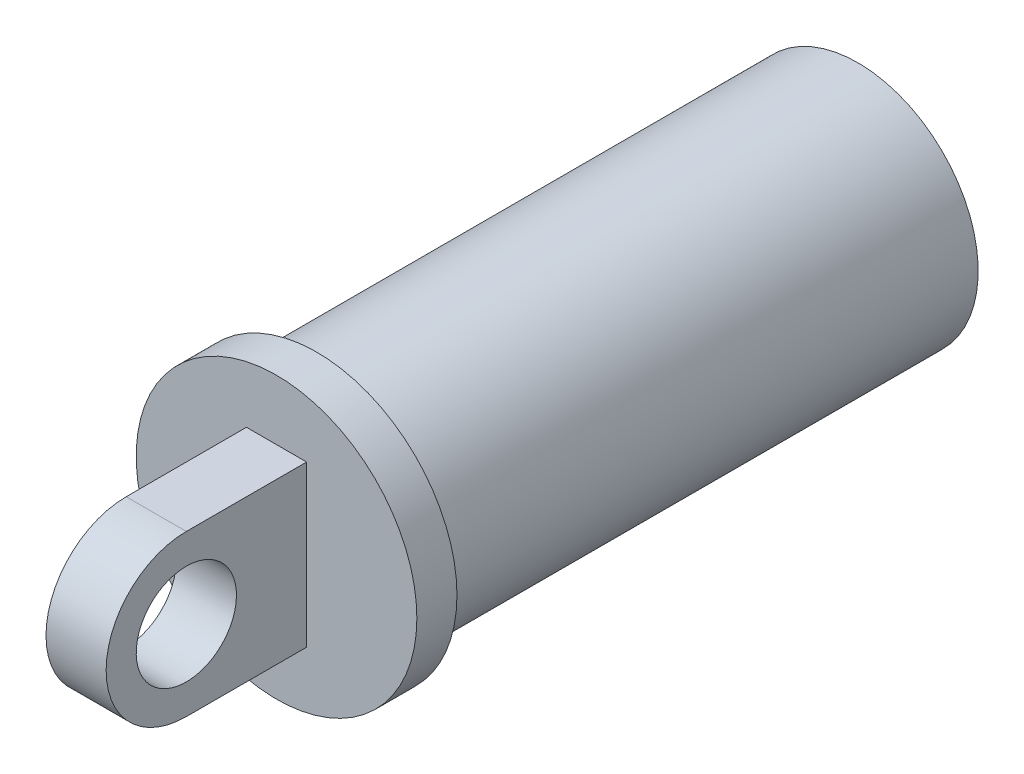
ISO-10303-21;
HEADER;
FILE_DESCRIPTION(('STEP AP214'),'2;1');
FILE_NAME('part.step','',(''),(''),'','','');
FILE_SCHEMA(('AUTOMOTIVE_DESIGN { 1 0 10303 214 1 1 1 1 }'));
ENDSEC;
DATA;
#1=APPLICATION_CONTEXT('core data for automotive mechanical design processes');
#2=APPLICATION_PROTOCOL_DEFINITION('international standard','automotive_design',2000,#1);
#3=PRODUCT_CONTEXT('',#1,'mechanical');
#4=PRODUCT('Part','Part','',(#3));
#5=PRODUCT_RELATED_PRODUCT_CATEGORY('part','',(#4));
#6=PRODUCT_DEFINITION_FORMATION('','',#4);
#7=PRODUCT_DEFINITION_CONTEXT('part definition',#1,'design');
#8=PRODUCT_DEFINITION('design','',#6,#7);
#9=PRODUCT_DEFINITION_SHAPE('','',#8);
#10=(LENGTH_UNIT() NAMED_UNIT(*) SI_UNIT(.MILLI.,.METRE.));
#11=(NAMED_UNIT(*) PLANE_ANGLE_UNIT() SI_UNIT($,.RADIAN.));
#12=(NAMED_UNIT(*) SI_UNIT($,.STERADIAN.) SOLID_ANGLE_UNIT());
#13=UNCERTAINTY_MEASURE_WITH_UNIT(LENGTH_MEASURE(1.E-05),#10,'distance_accuracy_value','');
#14=(GEOMETRIC_REPRESENTATION_CONTEXT(3) GLOBAL_UNCERTAINTY_ASSIGNED_CONTEXT((#13)) GLOBAL_UNIT_ASSIGNED_CONTEXT((#10,
#11,#12)) REPRESENTATION_CONTEXT('',''));
#15=CARTESIAN_POINT('',(0.,0.,0.));
#16=DIRECTION('',(0.,0.,1.));
#17=DIRECTION('',(1.,0.,0.));
#18=AXIS2_PLACEMENT_3D('',#15,#16,#17);
#19=CARTESIAN_POINT('',(0.,0.,0.));
#20=DIRECTION('',(0.,0.,1.));
#21=DIRECTION('',(-1.,0.,0.));
#22=AXIS2_PLACEMENT_3D('',#19,#20,#21);
#23=CYLINDRICAL_SURFACE('',#22,6.);
#24=CARTESIAN_POINT('',(0.,0.,12.5));
#25=DIRECTION('',(0.,0.,-1.));
#26=DIRECTION('',(-1.,0.,0.));
#27=AXIS2_PLACEMENT_3D('',#24,#25,#26);
#28=CIRCLE('',#27,6.);
#29=CARTESIAN_POINT('',(6.,0.,12.5));
#30=VERTEX_POINT('',#29);
#31=EDGE_CURVE('E145',#30,#30,#28,.T.);
#32=ORIENTED_EDGE('',*,*,#31,.T.);
#33=EDGE_LOOP('',(#32));
#34=FACE_BOUND('',#33,.T.);
#35=CARTESIAN_POINT('',(0.,0.,-14.5));
#36=DIRECTION('',(0.,0.,1.));
#37=DIRECTION('',(1.,0.,0.));
#38=AXIS2_PLACEMENT_3D('',#35,#36,#37);
#39=CIRCLE('',#38,6.);
#40=CARTESIAN_POINT('',(-6.,0.,-14.5));
#41=VERTEX_POINT('',#40);
#42=EDGE_CURVE('E128',#41,#41,#39,.T.);
#43=ORIENTED_EDGE('',*,*,#42,.T.);
#44=EDGE_LOOP('',(#43));
#45=FACE_BOUND('',#44,.T.);
#46=ADVANCED_FACE('F16',(#34,#45),#23,.T.);
#47=CARTESIAN_POINT('',(0.,0.,0.));
#48=DIRECTION('',(0.,0.,1.));
#49=DIRECTION('',(-1.,0.,0.));
#50=AXIS2_PLACEMENT_3D('',#47,#48,#49);
#51=CYLINDRICAL_SURFACE('',#50,5.);
#52=CARTESIAN_POINT('',(0.,0.,12.5));
#53=DIRECTION('',(0.,0.,-1.));
#54=DIRECTION('',(-1.,0.,0.));
#55=AXIS2_PLACEMENT_3D('',#52,#53,#54);
#56=CIRCLE('',#55,5.);
#57=CARTESIAN_POINT('',(5.,0.,12.5));
#58=VERTEX_POINT('',#57);
#59=EDGE_CURVE('E27',#58,#58,#56,.T.);
#60=ORIENTED_EDGE('',*,*,#59,.F.);
#61=EDGE_LOOP('',(#60));
#62=FACE_BOUND('',#61,.T.);
#63=CARTESIAN_POINT('',(0.,0.,-12.5));
#64=DIRECTION('',(0.,0.,1.));
#65=DIRECTION('',(-1.,0.,0.));
#66=AXIS2_PLACEMENT_3D('',#63,#64,#65);
#67=CIRCLE('',#66,5.);
#68=CARTESIAN_POINT('',(5.,0.,-12.5));
#69=VERTEX_POINT('',#68);
#70=EDGE_CURVE('E112',#69,#69,#67,.T.);
#71=ORIENTED_EDGE('',*,*,#70,.F.);
#72=EDGE_LOOP('',(#71));
#73=FACE_BOUND('',#72,.T.);
#74=ADVANCED_FACE('F228',(#62,#73),#51,.F.);
#75=CARTESIAN_POINT('',(0.,0.,14.5));
#76=DIRECTION('',(0.,0.,-1.));
#77=DIRECTION('',(0.,-1.,0.));
#78=AXIS2_PLACEMENT_3D('',#75,#76,#77);
#79=PLANE('',#78);
#80=DIRECTION('',(0.,1.,0.));
#81=VECTOR('',#80,1.);
#82=CARTESIAN_POINT('',(-1.5,-4.,14.5));
#83=LINE('',#82,#81);
#84=CARTESIAN_POINT('',(-1.5,-4.,14.5));
#85=VERTEX_POINT('',#84);
#86=CARTESIAN_POINT('',(-1.5,4.,14.5));
#87=VERTEX_POINT('',#86);
#88=EDGE_CURVE('E158',#85,#87,#83,.T.);
#89=ORIENTED_EDGE('',*,*,#88,.T.);
#90=DIRECTION('',(1.,0.,0.));
#91=VECTOR('',#90,1.);
#92=CARTESIAN_POINT('',(-1.5,4.,14.5));
#93=LINE('',#92,#91);
#94=CARTESIAN_POINT('',(1.5,4.,14.5));
#95=VERTEX_POINT('',#94);
#96=EDGE_CURVE('E149',#87,#95,#93,.T.);
#97=ORIENTED_EDGE('',*,*,#96,.T.);
#98=DIRECTION('',(0.,-1.,0.));
#99=VECTOR('',#98,1.);
#100=CARTESIAN_POINT('',(1.5,4.,14.5));
#101=LINE('',#100,#99);
#102=CARTESIAN_POINT('',(1.5,-4.,14.5));
#103=VERTEX_POINT('',#102);
#104=EDGE_CURVE('E20',#95,#103,#101,.T.);
#105=ORIENTED_EDGE('',*,*,#104,.T.);
#106=DIRECTION('',(-1.,0.,0.));
#107=VECTOR('',#106,1.);
#108=CARTESIAN_POINT('',(1.5,-4.,14.5));
#109=LINE('',#108,#107);
#110=EDGE_CURVE('E97',#103,#85,#109,.T.);
#111=ORIENTED_EDGE('',*,*,#110,.T.);
#112=EDGE_LOOP('',(#89,#97,#105,#111));
#113=FACE_BOUND('',#112,.T.);
#114=CARTESIAN_POINT('',(0.,0.,14.5));
#115=DIRECTION('',(0.,0.,-1.));
#116=DIRECTION('',(-1.,0.,0.));
#117=AXIS2_PLACEMENT_3D('',#114,#115,#116);
#118=CIRCLE('',#117,7.);
#119=CARTESIAN_POINT('',(7.,0.,14.5));
#120=VERTEX_POINT('',#119);
#121=EDGE_CURVE('E10',#120,#120,#118,.T.);
#122=ORIENTED_EDGE('',*,*,#121,.F.);
#123=EDGE_LOOP('',(#122));
#124=FACE_BOUND('',#123,.T.);
#125=ADVANCED_FACE('F233',(#113,#124),#79,.F.);
#126=CARTESIAN_POINT('',(0.,0.,12.5));
#127=DIRECTION('',(0.,0.,1.));
#128=DIRECTION('',(-1.,0.,0.));
#129=AXIS2_PLACEMENT_3D('',#126,#127,#128);
#130=CYLINDRICAL_SURFACE('',#129,7.);
#131=CARTESIAN_POINT('',(0.,0.,12.5));
#132=DIRECTION('',(0.,0.,-1.));
#133=DIRECTION('',(-1.,0.,0.));
#134=AXIS2_PLACEMENT_3D('',#131,#132,#133);
#135=CIRCLE('',#134,7.);
#136=CARTESIAN_POINT('',(7.,0.,12.5));
#137=VERTEX_POINT('',#136);
#138=EDGE_CURVE('E185',#137,#137,#135,.T.);
#139=ORIENTED_EDGE('',*,*,#138,.F.);
#140=EDGE_LOOP('',(#139));
#141=FACE_BOUND('',#140,.T.);
#142=ORIENTED_EDGE('',*,*,#121,.T.);
#143=EDGE_LOOP('',(#142));
#144=FACE_BOUND('',#143,.T.);
#145=ADVANCED_FACE('F251',(#141,#144),#130,.T.);
#146=CARTESIAN_POINT('',(0.,0.,12.5));
#147=DIRECTION('',(0.,0.,-1.));
#148=DIRECTION('',(0.,-1.,0.));
#149=AXIS2_PLACEMENT_3D('',#146,#147,#148);
#150=PLANE('',#149);
#151=ORIENTED_EDGE('',*,*,#59,.T.);
#152=EDGE_LOOP('',(#151));
#153=FACE_BOUND('',#152,.T.);
#154=ADVANCED_FACE('F249',(#153),#150,.T.);
#155=CARTESIAN_POINT('',(0.,0.,12.5));
#156=DIRECTION('',(0.,0.,-1.));
#157=DIRECTION('',(0.,-1.,0.));
#158=AXIS2_PLACEMENT_3D('',#155,#156,#157);
#159=PLANE('',#158);
#160=ORIENTED_EDGE('',*,*,#31,.F.);
#161=EDGE_LOOP('',(#160));
#162=FACE_BOUND('',#161,.T.);
#163=ORIENTED_EDGE('',*,*,#138,.T.);
#164=EDGE_LOOP('',(#163));
#165=FACE_BOUND('',#164,.T.);
#166=ADVANCED_FACE('F248',(#162,#165),#159,.T.);
#167=CARTESIAN_POINT('',(1.5,0.,19.5));
#168=DIRECTION('',(1.,0.,0.));
#169=DIRECTION('',(0.,1.,0.));
#170=AXIS2_PLACEMENT_3D('',#167,#168,#169);
#171=PLANE('',#170);
#172=CARTESIAN_POINT('',(1.5,0.,20.5));
#173=DIRECTION('',(-1.,0.,0.));
#174=DIRECTION('',(0.,-1.,0.));
#175=AXIS2_PLACEMENT_3D('',#172,#173,#174);
#176=CIRCLE('',#175,2.5);
#177=CARTESIAN_POINT('',(1.5,2.5,20.5));
#178=VERTEX_POINT('',#177);
#179=EDGE_CURVE('E147',#178,#178,#176,.T.);
#180=ORIENTED_EDGE('',*,*,#179,.T.);
#181=EDGE_LOOP('',(#180));
#182=FACE_BOUND('',#181,.T.);
#183=CARTESIAN_POINT('',(1.5,0.,20.5));
#184=DIRECTION('',(-1.,0.,0.));
#185=DIRECTION('',(0.,0.707106781186547,0.707106781186548));
#186=AXIS2_PLACEMENT_3D('',#183,#184,#185);
#187=CIRCLE('',#186,4.);
#188=CARTESIAN_POINT('',(1.5,-4.,20.5));
#189=VERTEX_POINT('',#188);
#190=CARTESIAN_POINT('',(1.5,4.,20.5));
#191=VERTEX_POINT('',#190);
#192=EDGE_CURVE('E135',#189,#191,#187,.T.);
#193=ORIENTED_EDGE('',*,*,#192,.F.);
#194=DIRECTION('',(0.,0.,1.));
#195=VECTOR('',#194,1.);
#196=CARTESIAN_POINT('',(1.5,-4.,14.5));
#197=LINE('',#196,#195);
#198=EDGE_CURVE('E130',#103,#189,#197,.T.);
#199=ORIENTED_EDGE('',*,*,#198,.F.);
#200=ORIENTED_EDGE('',*,*,#104,.F.);
#201=DIRECTION('',(0.,0.,-1.));
#202=VECTOR('',#201,1.);
#203=CARTESIAN_POINT('',(1.5,4.,20.5));
#204=LINE('',#203,#202);
#205=EDGE_CURVE('E153',#191,#95,#204,.T.);
#206=ORIENTED_EDGE('',*,*,#205,.F.);
#207=EDGE_LOOP('',(#193,#199,#200,#206));
#208=FACE_BOUND('',#207,.T.);
#209=ADVANCED_FACE('F210',(#182,#208),#171,.T.);
#210=CARTESIAN_POINT('',(0.,4.,24.5));
#211=DIRECTION('',(0.,1.,0.));
#212=DIRECTION('',(1.,0.,0.));
#213=AXIS2_PLACEMENT_3D('',#210,#211,#212);
#214=PLANE('',#213);
#215=DIRECTION('',(-1.,0.,0.));
#216=VECTOR('',#215,1.);
#217=CARTESIAN_POINT('',(1.5,4.,20.5));
#218=LINE('',#217,#216);
#219=CARTESIAN_POINT('',(-1.5,4.,20.5));
#220=VERTEX_POINT('',#219);
#221=EDGE_CURVE('E139',#191,#220,#218,.T.);
#222=ORIENTED_EDGE('',*,*,#221,.F.);
#223=ORIENTED_EDGE('',*,*,#205,.T.);
#224=ORIENTED_EDGE('',*,*,#96,.F.);
#225=DIRECTION('',(0.,0.,1.));
#226=VECTOR('',#225,1.);
#227=CARTESIAN_POINT('',(-1.5,4.,14.5));
#228=LINE('',#227,#226);
#229=EDGE_CURVE('E154',#87,#220,#228,.T.);
#230=ORIENTED_EDGE('',*,*,#229,.T.);
#231=EDGE_LOOP('',(#222,#223,#224,#230));
#232=FACE_BOUND('',#231,.T.);
#233=ADVANCED_FACE('F211',(#232),#214,.T.);
#234=CARTESIAN_POINT('',(0.,0.,20.5));
#235=DIRECTION('',(1.,0.,0.));
#236=DIRECTION('',(0.,-1.,0.));
#237=AXIS2_PLACEMENT_3D('',#234,#235,#236);
#238=CYLINDRICAL_SURFACE('',#237,2.5);
#239=ORIENTED_EDGE('',*,*,#179,.F.);
#240=EDGE_LOOP('',(#239));
#241=FACE_BOUND('',#240,.T.);
#242=CARTESIAN_POINT('',(-1.5,0.,20.5));
#243=DIRECTION('',(1.,0.,0.));
#244=DIRECTION('',(0.,-1.,0.));
#245=AXIS2_PLACEMENT_3D('',#242,#243,#244);
#246=CIRCLE('',#245,2.5);
#247=CARTESIAN_POINT('',(-1.5,2.5,20.5));
#248=VERTEX_POINT('',#247);
#249=EDGE_CURVE('E84',#248,#248,#246,.T.);
#250=ORIENTED_EDGE('',*,*,#249,.F.);
#251=EDGE_LOOP('',(#250));
#252=FACE_BOUND('',#251,.T.);
#253=ADVANCED_FACE('F241',(#241,#252),#238,.F.);
#254=CARTESIAN_POINT('',(0.,0.,-14.5));
#255=DIRECTION('',(0.,0.,1.));
#256=DIRECTION('',(1.,0.,0.));
#257=AXIS2_PLACEMENT_3D('',#254,#255,#256);
#258=PLANE('',#257);
#259=CARTESIAN_POINT('',(0.,0.,-14.5));
#260=DIRECTION('',(0.,0.,1.));
#261=DIRECTION('',(1.,0.,0.));
#262=AXIS2_PLACEMENT_3D('',#259,#260,#261);
#263=CIRCLE('',#262,2.);
#264=CARTESIAN_POINT('',(-2.,0.,-14.5));
#265=VERTEX_POINT('',#264);
#266=EDGE_CURVE('E121',#265,#265,#263,.T.);
#267=ORIENTED_EDGE('',*,*,#266,.T.);
#268=EDGE_LOOP('',(#267));
#269=FACE_BOUND('',#268,.T.);
#270=ORIENTED_EDGE('',*,*,#42,.F.);
#271=EDGE_LOOP('',(#270));
#272=FACE_BOUND('',#271,.T.);
#273=ADVANCED_FACE('F238',(#269,#272),#258,.F.);
#274=CARTESIAN_POINT('',(0.,0.,-12.5));
#275=DIRECTION('',(0.,0.,-1.));
#276=DIRECTION('',(1.,0.,0.));
#277=AXIS2_PLACEMENT_3D('',#274,#275,#276);
#278=CYLINDRICAL_SURFACE('',#277,2.);
#279=CARTESIAN_POINT('',(0.,0.,-12.5));
#280=DIRECTION('',(0.,0.,-1.));
#281=DIRECTION('',(1.,0.,0.));
#282=AXIS2_PLACEMENT_3D('',#279,#280,#281);
#283=CIRCLE('',#282,2.);
#284=CARTESIAN_POINT('',(-2.,0.,-12.5));
#285=VERTEX_POINT('',#284);
#286=EDGE_CURVE('E117',#285,#285,#283,.T.);
#287=ORIENTED_EDGE('',*,*,#286,.F.);
#288=EDGE_LOOP('',(#287));
#289=FACE_BOUND('',#288,.T.);
#290=ORIENTED_EDGE('',*,*,#266,.F.);
#291=EDGE_LOOP('',(#290));
#292=FACE_BOUND('',#291,.T.);
#293=ADVANCED_FACE('F18',(#289,#292),#278,.F.);
#294=CARTESIAN_POINT('',(0.,0.,-12.5));
#295=DIRECTION('',(0.,0.,1.));
#296=DIRECTION('',(1.,0.,0.));
#297=AXIS2_PLACEMENT_3D('',#294,#295,#296);
#298=PLANE('',#297);
#299=ORIENTED_EDGE('',*,*,#286,.T.);
#300=EDGE_LOOP('',(#299));
#301=FACE_BOUND('',#300,.T.);
#302=ORIENTED_EDGE('',*,*,#70,.T.);
#303=EDGE_LOOP('',(#302));
#304=FACE_BOUND('',#303,.T.);
#305=ADVANCED_FACE('F118',(#301,#304),#298,.T.);
#306=CARTESIAN_POINT('',(0.,-4.,14.5));
#307=DIRECTION('',(0.,-1.,0.));
#308=DIRECTION('',(0.,0.,-1.));
#309=AXIS2_PLACEMENT_3D('',#306,#307,#308);
#310=PLANE('',#309);
#311=DIRECTION('',(1.,0.,0.));
#312=VECTOR('',#311,1.);
#313=CARTESIAN_POINT('',(-1.5,-4.,20.5));
#314=LINE('',#313,#312);
#315=CARTESIAN_POINT('',(-1.5,-4.,20.5));
#316=VERTEX_POINT('',#315);
#317=EDGE_CURVE('E142',#316,#189,#314,.T.);
#318=ORIENTED_EDGE('',*,*,#317,.F.);
#319=DIRECTION('',(0.,0.,-1.));
#320=VECTOR('',#319,1.);
#321=CARTESIAN_POINT('',(-1.5,-4.,20.5));
#322=LINE('',#321,#320);
#323=EDGE_CURVE('E160',#316,#85,#322,.T.);
#324=ORIENTED_EDGE('',*,*,#323,.T.);
#325=ORIENTED_EDGE('',*,*,#110,.F.);
#326=ORIENTED_EDGE('',*,*,#198,.T.);
#327=EDGE_LOOP('',(#318,#324,#325,#326));
#328=FACE_BOUND('',#327,.T.);
#329=ADVANCED_FACE('F216',(#328),#310,.T.);
#330=CARTESIAN_POINT('',(0.,0.,20.5));
#331=DIRECTION('',(1.,0.,0.));
#332=DIRECTION('',(0.,-0.707106781186547,0.707106781186548));
#333=AXIS2_PLACEMENT_3D('',#330,#331,#332);
#334=CYLINDRICAL_SURFACE('',#333,4.);
#335=ORIENTED_EDGE('',*,*,#192,.T.);
#336=ORIENTED_EDGE('',*,*,#221,.T.);
#337=CARTESIAN_POINT('',(-1.5,0.,20.5));
#338=DIRECTION('',(1.,0.,0.));
#339=DIRECTION('',(0.,-0.707106781186547,0.707106781186548));
#340=AXIS2_PLACEMENT_3D('',#337,#338,#339);
#341=CIRCLE('',#340,4.);
#342=EDGE_CURVE('E159',#220,#316,#341,.T.);
#343=ORIENTED_EDGE('',*,*,#342,.T.);
#344=ORIENTED_EDGE('',*,*,#317,.T.);
#345=EDGE_LOOP('',(#335,#336,#343,#344));
#346=FACE_BOUND('',#345,.T.);
#347=ADVANCED_FACE('F204',(#346),#334,.T.);
#348=CARTESIAN_POINT('',(-1.5,0.,19.5));
#349=DIRECTION('',(1.,0.,0.));
#350=DIRECTION('',(0.,1.,0.));
#351=AXIS2_PLACEMENT_3D('',#348,#349,#350);
#352=PLANE('',#351);
#353=ORIENTED_EDGE('',*,*,#249,.T.);
#354=EDGE_LOOP('',(#353));
#355=FACE_BOUND('',#354,.T.);
#356=ORIENTED_EDGE('',*,*,#342,.F.);
#357=ORIENTED_EDGE('',*,*,#229,.F.);
#358=ORIENTED_EDGE('',*,*,#88,.F.);
#359=ORIENTED_EDGE('',*,*,#323,.F.);
#360=EDGE_LOOP('',(#356,#357,#358,#359));
#361=FACE_BOUND('',#360,.T.);
#362=ADVANCED_FACE('F215',(#355,#361),#352,.F.);
#363=CLOSED_SHELL('',(#46,#74,#125,#145,#154,#166,#209,#233,#253,#273,#293,#305,#329,#347,#362));
#364=MANIFOLD_SOLID_BREP('B1',#363);
#365=ADVANCED_BREP_SHAPE_REPRESENTATION('',(#18,#364),#14);
#366=SHAPE_DEFINITION_REPRESENTATION(#9,#365);
ENDSEC;
END-ISO-10303-21;
